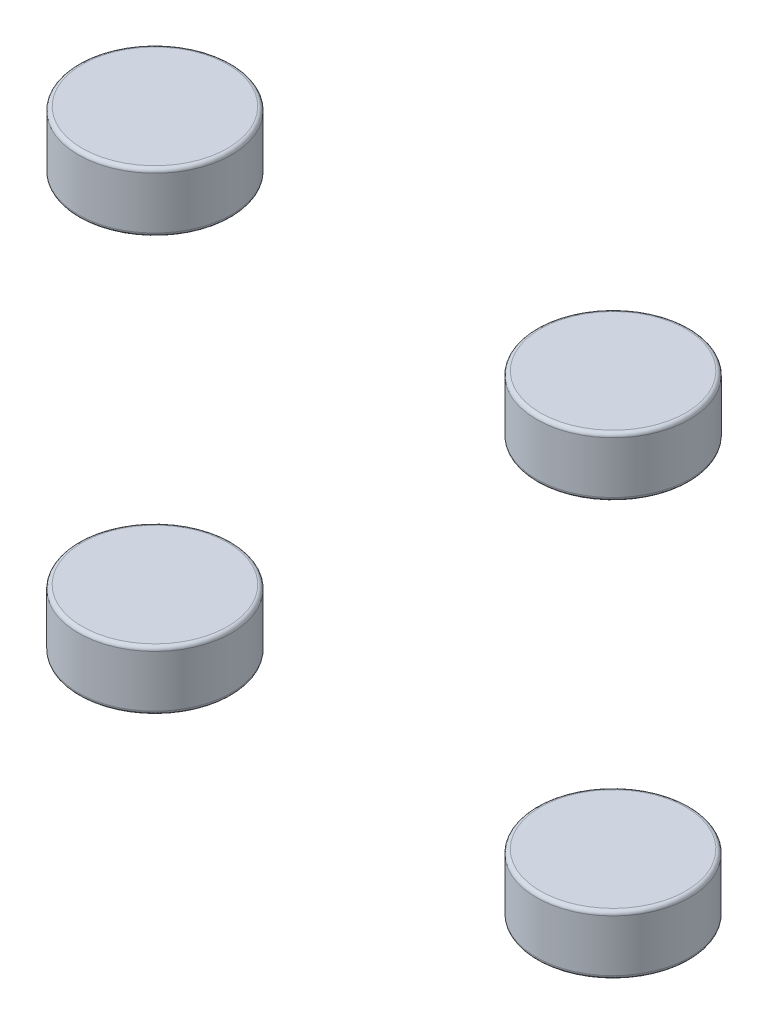
ISO-10303-21;
HEADER;
FILE_DESCRIPTION(('STEP AP214'),'2;1');
FILE_NAME('part.step','',(''),(''),'','','');
FILE_SCHEMA(('AUTOMOTIVE_DESIGN { 1 0 10303 214 1 1 1 1 }'));
ENDSEC;
DATA;
#1=APPLICATION_CONTEXT('core data for automotive mechanical design processes');
#2=APPLICATION_PROTOCOL_DEFINITION('international standard','automotive_design',2000,#1);
#3=PRODUCT_CONTEXT('',#1,'mechanical');
#4=PRODUCT('Part','Part','',(#3));
#5=PRODUCT_RELATED_PRODUCT_CATEGORY('part','',(#4));
#6=PRODUCT_DEFINITION_FORMATION('','',#4);
#7=PRODUCT_DEFINITION_CONTEXT('part definition',#1,'design');
#8=PRODUCT_DEFINITION('design','',#6,#7);
#9=PRODUCT_DEFINITION_SHAPE('','',#8);
#10=(LENGTH_UNIT() NAMED_UNIT(*) SI_UNIT(.MILLI.,.METRE.));
#11=(NAMED_UNIT(*) PLANE_ANGLE_UNIT() SI_UNIT($,.RADIAN.));
#12=(NAMED_UNIT(*) SI_UNIT($,.STERADIAN.) SOLID_ANGLE_UNIT());
#13=UNCERTAINTY_MEASURE_WITH_UNIT(LENGTH_MEASURE(1.E-05),#10,'distance_accuracy_value','');
#14=(GEOMETRIC_REPRESENTATION_CONTEXT(3) GLOBAL_UNCERTAINTY_ASSIGNED_CONTEXT((#13)) GLOBAL_UNIT_ASSIGNED_CONTEXT((#10,
#11,#12)) REPRESENTATION_CONTEXT('',''));
#15=CARTESIAN_POINT('',(0.,0.,0.));
#16=DIRECTION('',(0.,0.,1.));
#17=DIRECTION('',(1.,0.,0.));
#18=AXIS2_PLACEMENT_3D('',#15,#16,#17);
#19=CARTESIAN_POINT('',(0.,600.,0.));
#20=DIRECTION('',(0.,1.,0.));
#21=DIRECTION('',(0.,0.,1.));
#22=AXIS2_PLACEMENT_3D('',#19,#20,#21);
#23=PLANE('',#22);
#24=CARTESIAN_POINT('',(-420.,600.,235.));
#25=DIRECTION('',(0.,1.,0.));
#26=DIRECTION('',(0.,0.,1.));
#27=AXIS2_PLACEMENT_3D('',#24,#25,#26);
#28=CIRCLE('',#27,246.);
#29=CARTESIAN_POINT('',(-420.,600.,481.));
#30=VERTEX_POINT('',#29);
#31=EDGE_CURVE('E102',#30,#30,#28,.F.);
#32=ORIENTED_EDGE('',*,*,#31,.T.);
#33=EDGE_LOOP('',(#32));
#34=FACE_BOUND('',#33,.T.);
#35=ADVANCED_FACE('F95',(#34),#23,.F.);
#36=CARTESIAN_POINT('',(0.,801.,0.));
#37=DIRECTION('',(0.,1.,0.));
#38=DIRECTION('',(0.,0.,1.));
#39=AXIS2_PLACEMENT_3D('',#36,#37,#38);
#40=PLANE('',#39);
#41=CARTESIAN_POINT('',(-420.,801.,235.));
#42=DIRECTION('',(0.,1.,0.));
#43=DIRECTION('',(0.,0.,1.));
#44=AXIS2_PLACEMENT_3D('',#41,#42,#43);
#45=CIRCLE('',#44,246.);
#46=CARTESIAN_POINT('',(-420.,801.,481.));
#47=VERTEX_POINT('',#46);
#48=EDGE_CURVE('E12',#47,#47,#45,.T.);
#49=ORIENTED_EDGE('',*,*,#48,.T.);
#50=EDGE_LOOP('',(#49));
#51=FACE_BOUND('',#50,.T.);
#52=ADVANCED_FACE('F126',(#51),#40,.T.);
#53=CARTESIAN_POINT('',(-420.,600.,235.));
#54=DIRECTION('',(0.,1.,0.));
#55=DIRECTION('',(0.,0.,1.));
#56=AXIS2_PLACEMENT_3D('',#53,#54,#55);
#57=CYLINDRICAL_SURFACE('',#56,259.);
#58=CARTESIAN_POINT('',(-420.,613.,235.));
#59=DIRECTION('',(0.,1.,0.));
#60=DIRECTION('',(0.,0.,1.));
#61=AXIS2_PLACEMENT_3D('',#58,#59,#60);
#62=CIRCLE('',#61,259.);
#63=CARTESIAN_POINT('',(-420.,613.,494.));
#64=VERTEX_POINT('',#63);
#65=EDGE_CURVE('E106',#64,#64,#62,.T.);
#66=ORIENTED_EDGE('',*,*,#65,.T.);
#67=EDGE_LOOP('',(#66));
#68=FACE_BOUND('',#67,.T.);
#69=CARTESIAN_POINT('',(-420.,788.,235.));
#70=DIRECTION('',(0.,1.,0.));
#71=DIRECTION('',(0.,0.,1.));
#72=AXIS2_PLACEMENT_3D('',#69,#70,#71);
#73=CIRCLE('',#72,259.);
#74=CARTESIAN_POINT('',(-420.,788.,494.));
#75=VERTEX_POINT('',#74);
#76=EDGE_CURVE('E110',#75,#75,#73,.F.);
#77=ORIENTED_EDGE('',*,*,#76,.T.);
#78=EDGE_LOOP('',(#77));
#79=FACE_BOUND('',#78,.T.);
#80=ADVANCED_FACE('F116',(#68,#79),#57,.T.);
#81=CARTESIAN_POINT('',(-420.,613.,235.));
#82=DIRECTION('',(0.,1.,0.));
#83=DIRECTION('',(0.,0.,1.));
#84=AXIS2_PLACEMENT_3D('',#81,#82,#83);
#85=TOROIDAL_SURFACE('',#84,246.,13.);
#86=ORIENTED_EDGE('',*,*,#31,.F.);
#87=EDGE_LOOP('',(#86));
#88=FACE_BOUND('',#87,.T.);
#89=ORIENTED_EDGE('',*,*,#65,.F.);
#90=EDGE_LOOP('',(#89));
#91=FACE_BOUND('',#90,.T.);
#92=ADVANCED_FACE('F120',(#88,#91),#85,.T.);
#93=CARTESIAN_POINT('',(-420.,788.,235.));
#94=DIRECTION('',(0.,1.,0.));
#95=DIRECTION('',(0.,0.,1.));
#96=AXIS2_PLACEMENT_3D('',#93,#94,#95);
#97=TOROIDAL_SURFACE('',#96,246.,13.);
#98=ORIENTED_EDGE('',*,*,#76,.F.);
#99=EDGE_LOOP('',(#98));
#100=FACE_BOUND('',#99,.T.);
#101=ORIENTED_EDGE('',*,*,#48,.F.);
#102=EDGE_LOOP('',(#101));
#103=FACE_BOUND('',#102,.T.);
#104=ADVANCED_FACE('F97',(#100,#103),#97,.T.);
#105=CLOSED_SHELL('',(#35,#52,#80,#92,#104));
#106=MANIFOLD_SOLID_BREP('B2',#105);
#107=CARTESIAN_POINT('',(0.,600.,0.));
#108=DIRECTION('',(0.,1.,0.));
#109=DIRECTION('',(0.,0.,1.));
#110=AXIS2_PLACEMENT_3D('',#107,#108,#109);
#111=PLANE('',#110);
#112=CARTESIAN_POINT('',(1130.,600.,235.));
#113=DIRECTION('',(0.,1.,0.));
#114=DIRECTION('',(0.,0.,1.));
#115=AXIS2_PLACEMENT_3D('',#112,#113,#114);
#116=CIRCLE('',#115,246.);
#117=CARTESIAN_POINT('',(1130.,600.,481.));
#118=VERTEX_POINT('',#117);
#119=EDGE_CURVE('E180',#118,#118,#116,.F.);
#120=ORIENTED_EDGE('',*,*,#119,.T.);
#121=EDGE_LOOP('',(#120));
#122=FACE_BOUND('',#121,.T.);
#123=ADVANCED_FACE('F173',(#122),#111,.F.);
#124=CARTESIAN_POINT('',(0.,801.,0.));
#125=DIRECTION('',(0.,1.,0.));
#126=DIRECTION('',(0.,0.,1.));
#127=AXIS2_PLACEMENT_3D('',#124,#125,#126);
#128=PLANE('',#127);
#129=CARTESIAN_POINT('',(1130.,801.,235.));
#130=DIRECTION('',(0.,1.,0.));
#131=DIRECTION('',(0.,0.,1.));
#132=AXIS2_PLACEMENT_3D('',#129,#130,#131);
#133=CIRCLE('',#132,246.);
#134=CARTESIAN_POINT('',(1130.,801.,481.));
#135=VERTEX_POINT('',#134);
#136=EDGE_CURVE('E94',#135,#135,#133,.T.);
#137=ORIENTED_EDGE('',*,*,#136,.T.);
#138=EDGE_LOOP('',(#137));
#139=FACE_BOUND('',#138,.T.);
#140=ADVANCED_FACE('F204',(#139),#128,.T.);
#141=CARTESIAN_POINT('',(1130.,600.,235.));
#142=DIRECTION('',(0.,1.,0.));
#143=DIRECTION('',(0.,0.,1.));
#144=AXIS2_PLACEMENT_3D('',#141,#142,#143);
#145=CYLINDRICAL_SURFACE('',#144,259.);
#146=CARTESIAN_POINT('',(1130.,613.,235.));
#147=DIRECTION('',(0.,1.,0.));
#148=DIRECTION('',(0.,0.,1.));
#149=AXIS2_PLACEMENT_3D('',#146,#147,#148);
#150=CIRCLE('',#149,259.);
#151=CARTESIAN_POINT('',(1130.,613.,494.));
#152=VERTEX_POINT('',#151);
#153=EDGE_CURVE('E184',#152,#152,#150,.T.);
#154=ORIENTED_EDGE('',*,*,#153,.T.);
#155=EDGE_LOOP('',(#154));
#156=FACE_BOUND('',#155,.T.);
#157=CARTESIAN_POINT('',(1130.,788.,235.));
#158=DIRECTION('',(0.,1.,0.));
#159=DIRECTION('',(0.,0.,1.));
#160=AXIS2_PLACEMENT_3D('',#157,#158,#159);
#161=CIRCLE('',#160,259.);
#162=CARTESIAN_POINT('',(1130.,788.,494.));
#163=VERTEX_POINT('',#162);
#164=EDGE_CURVE('E188',#163,#163,#161,.F.);
#165=ORIENTED_EDGE('',*,*,#164,.T.);
#166=EDGE_LOOP('',(#165));
#167=FACE_BOUND('',#166,.T.);
#168=ADVANCED_FACE('F194',(#156,#167),#145,.T.);
#169=CARTESIAN_POINT('',(1130.,613.,235.));
#170=DIRECTION('',(0.,1.,0.));
#171=DIRECTION('',(0.,0.,1.));
#172=AXIS2_PLACEMENT_3D('',#169,#170,#171);
#173=TOROIDAL_SURFACE('',#172,246.,13.);
#174=ORIENTED_EDGE('',*,*,#119,.F.);
#175=EDGE_LOOP('',(#174));
#176=FACE_BOUND('',#175,.T.);
#177=ORIENTED_EDGE('',*,*,#153,.F.);
#178=EDGE_LOOP('',(#177));
#179=FACE_BOUND('',#178,.T.);
#180=ADVANCED_FACE('F198',(#176,#179),#173,.T.);
#181=CARTESIAN_POINT('',(1130.,788.,235.));
#182=DIRECTION('',(0.,1.,0.));
#183=DIRECTION('',(0.,0.,1.));
#184=AXIS2_PLACEMENT_3D('',#181,#182,#183);
#185=TOROIDAL_SURFACE('',#184,246.,13.);
#186=ORIENTED_EDGE('',*,*,#164,.F.);
#187=EDGE_LOOP('',(#186));
#188=FACE_BOUND('',#187,.T.);
#189=ORIENTED_EDGE('',*,*,#136,.F.);
#190=EDGE_LOOP('',(#189));
#191=FACE_BOUND('',#190,.T.);
#192=ADVANCED_FACE('F175',(#188,#191),#185,.T.);
#193=CLOSED_SHELL('',(#123,#140,#168,#180,#192));
#194=MANIFOLD_SOLID_BREP('B7',#193);
#195=CARTESIAN_POINT('',(0.,-600.,0.));
#196=DIRECTION('',(0.,-1.,0.));
#197=DIRECTION('',(0.,0.,-1.));
#198=AXIS2_PLACEMENT_3D('',#195,#196,#197);
#199=PLANE('',#198);
#200=CARTESIAN_POINT('',(1130.,-600.,235.));
#201=DIRECTION('',(0.,-1.,0.));
#202=DIRECTION('',(0.,0.,-1.));
#203=AXIS2_PLACEMENT_3D('',#200,#201,#202);
#204=CIRCLE('',#203,246.);
#205=CARTESIAN_POINT('',(1130.,-600.,-11.));
#206=VERTEX_POINT('',#205);
#207=EDGE_CURVE('E172',#206,#206,#204,.F.);
#208=ORIENTED_EDGE('',*,*,#207,.T.);
#209=EDGE_LOOP('',(#208));
#210=FACE_BOUND('',#209,.T.);
#211=ADVANCED_FACE('F250',(#210),#199,.F.);
#212=CARTESIAN_POINT('',(0.,-801.,0.));
#213=DIRECTION('',(0.,-1.,0.));
#214=DIRECTION('',(0.,0.,-1.));
#215=AXIS2_PLACEMENT_3D('',#212,#213,#214);
#216=PLANE('',#215);
#217=CARTESIAN_POINT('',(1130.,-801.,235.));
#218=DIRECTION('',(0.,-1.,0.));
#219=DIRECTION('',(0.,0.,-1.));
#220=AXIS2_PLACEMENT_3D('',#217,#218,#219);
#221=CIRCLE('',#220,246.);
#222=CARTESIAN_POINT('',(1130.,-801.,-11.));
#223=VERTEX_POINT('',#222);
#224=EDGE_CURVE('E257',#223,#223,#221,.T.);
#225=ORIENTED_EDGE('',*,*,#224,.T.);
#226=EDGE_LOOP('',(#225));
#227=FACE_BOUND('',#226,.T.);
#228=ADVANCED_FACE('F281',(#227),#216,.T.);
#229=CARTESIAN_POINT('',(1130.,-600.,235.));
#230=DIRECTION('',(0.,-1.,0.));
#231=DIRECTION('',(0.,0.,-1.));
#232=AXIS2_PLACEMENT_3D('',#229,#230,#231);
#233=CYLINDRICAL_SURFACE('',#232,259.);
#234=CARTESIAN_POINT('',(1130.,-788.,235.));
#235=DIRECTION('',(0.,-1.,0.));
#236=DIRECTION('',(0.,0.,-1.));
#237=AXIS2_PLACEMENT_3D('',#234,#235,#236);
#238=CIRCLE('',#237,259.);
#239=CARTESIAN_POINT('',(1130.,-788.,-24.));
#240=VERTEX_POINT('',#239);
#241=EDGE_CURVE('E261',#240,#240,#238,.F.);
#242=ORIENTED_EDGE('',*,*,#241,.T.);
#243=EDGE_LOOP('',(#242));
#244=FACE_BOUND('',#243,.T.);
#245=CARTESIAN_POINT('',(1130.,-613.,235.));
#246=DIRECTION('',(0.,-1.,0.));
#247=DIRECTION('',(0.,0.,-1.));
#248=AXIS2_PLACEMENT_3D('',#245,#246,#247);
#249=CIRCLE('',#248,259.);
#250=CARTESIAN_POINT('',(1130.,-613.,-24.));
#251=VERTEX_POINT('',#250);
#252=EDGE_CURVE('E265',#251,#251,#249,.T.);
#253=ORIENTED_EDGE('',*,*,#252,.T.);
#254=EDGE_LOOP('',(#253));
#255=FACE_BOUND('',#254,.T.);
#256=ADVANCED_FACE('F271',(#244,#255),#233,.T.);
#257=CARTESIAN_POINT('',(1130.,-788.,235.));
#258=DIRECTION('',(0.,-1.,0.));
#259=DIRECTION('',(0.,0.,-1.));
#260=AXIS2_PLACEMENT_3D('',#257,#258,#259);
#261=TOROIDAL_SURFACE('',#260,246.,13.);
#262=ORIENTED_EDGE('',*,*,#224,.F.);
#263=EDGE_LOOP('',(#262));
#264=FACE_BOUND('',#263,.T.);
#265=ORIENTED_EDGE('',*,*,#241,.F.);
#266=EDGE_LOOP('',(#265));
#267=FACE_BOUND('',#266,.T.);
#268=ADVANCED_FACE('F275',(#264,#267),#261,.T.);
#269=CARTESIAN_POINT('',(1130.,-613.,235.));
#270=DIRECTION('',(0.,-1.,0.));
#271=DIRECTION('',(0.,0.,-1.));
#272=AXIS2_PLACEMENT_3D('',#269,#270,#271);
#273=TOROIDAL_SURFACE('',#272,246.,13.);
#274=ORIENTED_EDGE('',*,*,#252,.F.);
#275=EDGE_LOOP('',(#274));
#276=FACE_BOUND('',#275,.T.);
#277=ORIENTED_EDGE('',*,*,#207,.F.);
#278=EDGE_LOOP('',(#277));
#279=FACE_BOUND('',#278,.T.);
#280=ADVANCED_FACE('F252',(#276,#279),#273,.T.);
#281=CLOSED_SHELL('',(#211,#228,#256,#268,#280));
#282=MANIFOLD_SOLID_BREP('B89_NOT_SHOWN',#281);
#283=CARTESIAN_POINT('',(0.,-600.,0.));
#284=DIRECTION('',(0.,-1.,0.));
#285=DIRECTION('',(0.,0.,-1.));
#286=AXIS2_PLACEMENT_3D('',#283,#284,#285);
#287=PLANE('',#286);
#288=CARTESIAN_POINT('',(-420.,-600.,235.));
#289=DIRECTION('',(0.,-1.,0.));
#290=DIRECTION('',(0.,0.,-1.));
#291=AXIS2_PLACEMENT_3D('',#288,#289,#290);
#292=CIRCLE('',#291,246.);
#293=CARTESIAN_POINT('',(-420.,-600.,-11.));
#294=VERTEX_POINT('',#293);
#295=EDGE_CURVE('E249',#294,#294,#292,.F.);
#296=ORIENTED_EDGE('',*,*,#295,.T.);
#297=EDGE_LOOP('',(#296));
#298=FACE_BOUND('',#297,.T.);
#299=ADVANCED_FACE('F320',(#298),#287,.F.);
#300=CARTESIAN_POINT('',(0.,-801.,0.));
#301=DIRECTION('',(0.,-1.,0.));
#302=DIRECTION('',(0.,0.,-1.));
#303=AXIS2_PLACEMENT_3D('',#300,#301,#302);
#304=PLANE('',#303);
#305=CARTESIAN_POINT('',(-420.,-801.,235.));
#306=DIRECTION('',(0.,-1.,0.));
#307=DIRECTION('',(0.,0.,-1.));
#308=AXIS2_PLACEMENT_3D('',#305,#306,#307);
#309=CIRCLE('',#308,246.);
#310=CARTESIAN_POINT('',(-420.,-801.,-11.));
#311=VERTEX_POINT('',#310);
#312=EDGE_CURVE('E327',#311,#311,#309,.T.);
#313=ORIENTED_EDGE('',*,*,#312,.T.);
#314=EDGE_LOOP('',(#313));
#315=FACE_BOUND('',#314,.T.);
#316=ADVANCED_FACE('F351',(#315),#304,.T.);
#317=CARTESIAN_POINT('',(-420.,-600.,235.));
#318=DIRECTION('',(0.,-1.,0.));
#319=DIRECTION('',(0.,0.,-1.));
#320=AXIS2_PLACEMENT_3D('',#317,#318,#319);
#321=CYLINDRICAL_SURFACE('',#320,259.);
#322=CARTESIAN_POINT('',(-420.,-788.,235.));
#323=DIRECTION('',(0.,-1.,0.));
#324=DIRECTION('',(0.,0.,-1.));
#325=AXIS2_PLACEMENT_3D('',#322,#323,#324);
#326=CIRCLE('',#325,259.);
#327=CARTESIAN_POINT('',(-420.,-788.,-24.));
#328=VERTEX_POINT('',#327);
#329=EDGE_CURVE('E331',#328,#328,#326,.F.);
#330=ORIENTED_EDGE('',*,*,#329,.T.);
#331=EDGE_LOOP('',(#330));
#332=FACE_BOUND('',#331,.T.);
#333=CARTESIAN_POINT('',(-420.,-613.,235.));
#334=DIRECTION('',(0.,-1.,0.));
#335=DIRECTION('',(0.,0.,-1.));
#336=AXIS2_PLACEMENT_3D('',#333,#334,#335);
#337=CIRCLE('',#336,259.);
#338=CARTESIAN_POINT('',(-420.,-613.,-24.));
#339=VERTEX_POINT('',#338);
#340=EDGE_CURVE('E335',#339,#339,#337,.T.);
#341=ORIENTED_EDGE('',*,*,#340,.T.);
#342=EDGE_LOOP('',(#341));
#343=FACE_BOUND('',#342,.T.);
#344=ADVANCED_FACE('F341',(#332,#343),#321,.T.);
#345=CARTESIAN_POINT('',(-420.,-788.,235.));
#346=DIRECTION('',(0.,-1.,0.));
#347=DIRECTION('',(0.,0.,-1.));
#348=AXIS2_PLACEMENT_3D('',#345,#346,#347);
#349=TOROIDAL_SURFACE('',#348,246.,13.);
#350=ORIENTED_EDGE('',*,*,#312,.F.);
#351=EDGE_LOOP('',(#350));
#352=FACE_BOUND('',#351,.T.);
#353=ORIENTED_EDGE('',*,*,#329,.F.);
#354=EDGE_LOOP('',(#353));
#355=FACE_BOUND('',#354,.T.);
#356=ADVANCED_FACE('F345',(#352,#355),#349,.T.);
#357=CARTESIAN_POINT('',(-420.,-613.,235.));
#358=DIRECTION('',(0.,-1.,0.));
#359=DIRECTION('',(0.,0.,-1.));
#360=AXIS2_PLACEMENT_3D('',#357,#358,#359);
#361=TOROIDAL_SURFACE('',#360,246.,13.);
#362=ORIENTED_EDGE('',*,*,#340,.F.);
#363=EDGE_LOOP('',(#362));
#364=FACE_BOUND('',#363,.T.);
#365=ORIENTED_EDGE('',*,*,#295,.F.);
#366=EDGE_LOOP('',(#365));
#367=FACE_BOUND('',#366,.T.);
#368=ADVANCED_FACE('F322',(#364,#367),#361,.T.);
#369=CLOSED_SHELL('',(#299,#316,#344,#356,#368));
#370=MANIFOLD_SOLID_BREP('B167_NOT_SHOWN',#369);
#371=ADVANCED_BREP_SHAPE_REPRESENTATION('',(#18,#106,#194,#282,#370),#14);
#372=SHAPE_DEFINITION_REPRESENTATION(#9,#371);
ENDSEC;
END-ISO-10303-21;
